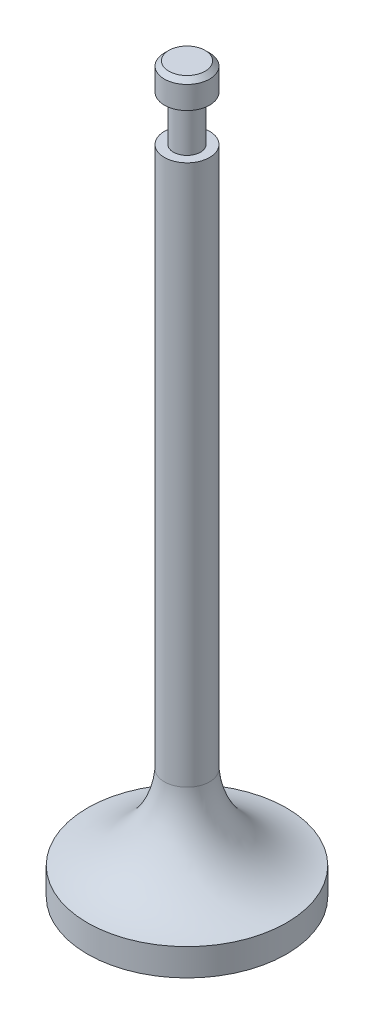
ISO-10303-21;
HEADER;
FILE_DESCRIPTION(('STEP AP214'),'2;1');
FILE_NAME('part.step','',(''),(''),'','','');
FILE_SCHEMA(('AUTOMOTIVE_DESIGN { 1 0 10303 214 1 1 1 1 }'));
ENDSEC;
DATA;
#1=APPLICATION_CONTEXT('core data for automotive mechanical design processes');
#2=APPLICATION_PROTOCOL_DEFINITION('international standard','automotive_design',2000,#1);
#3=PRODUCT_CONTEXT('',#1,'mechanical');
#4=PRODUCT('Part','Part','',(#3));
#5=PRODUCT_RELATED_PRODUCT_CATEGORY('part','',(#4));
#6=PRODUCT_DEFINITION_FORMATION('','',#4);
#7=PRODUCT_DEFINITION_CONTEXT('part definition',#1,'design');
#8=PRODUCT_DEFINITION('design','',#6,#7);
#9=PRODUCT_DEFINITION_SHAPE('','',#8);
#10=(LENGTH_UNIT() NAMED_UNIT(*) SI_UNIT(.MILLI.,.METRE.));
#11=(NAMED_UNIT(*) PLANE_ANGLE_UNIT() SI_UNIT($,.RADIAN.));
#12=(NAMED_UNIT(*) SI_UNIT($,.STERADIAN.) SOLID_ANGLE_UNIT());
#13=UNCERTAINTY_MEASURE_WITH_UNIT(LENGTH_MEASURE(1.E-05),#10,'distance_accuracy_value','');
#14=(GEOMETRIC_REPRESENTATION_CONTEXT(3) GLOBAL_UNCERTAINTY_ASSIGNED_CONTEXT((#13)) GLOBAL_UNIT_ASSIGNED_CONTEXT((#10,
#11,#12)) REPRESENTATION_CONTEXT('',''));
#15=CARTESIAN_POINT('',(0.,0.,0.));
#16=DIRECTION('',(0.,0.,1.));
#17=DIRECTION('',(1.,0.,0.));
#18=AXIS2_PLACEMENT_3D('',#15,#16,#17);
#19=CARTESIAN_POINT('',(2.49999999999998,80.,0.));
#20=DIRECTION('',(0.,-1.,0.));
#21=DIRECTION('',(1.,0.,0.));
#22=AXIS2_PLACEMENT_3D('',#19,#20,#21);
#23=PLANE('',#22);
#24=CARTESIAN_POINT('',(0.,80.,0.));
#25=DIRECTION('',(0.,-1.,0.));
#26=DIRECTION('',(1.,0.,0.));
#27=AXIS2_PLACEMENT_3D('',#24,#25,#26);
#28=CIRCLE('',#27,2.00000000000001);
#29=CARTESIAN_POINT('',(1.99999999999999,80.,0.));
#30=VERTEX_POINT('',#29);
#31=EDGE_CURVE('E45',#30,#30,#28,.F.);
#32=ORIENTED_EDGE('',*,*,#31,.T.);
#33=EDGE_LOOP('',(#32));
#34=FACE_BOUND('',#33,.T.);
#35=ADVANCED_FACE('F37',(#34),#23,.F.);
#36=CARTESIAN_POINT('',(0.,80.,0.));
#37=DIRECTION('',(0.,1.,0.));
#38=DIRECTION('',(-1.,0.,0.));
#39=AXIS2_PLACEMENT_3D('',#36,#37,#38);
#40=CYLINDRICAL_SURFACE('',#39,2.5);
#41=CARTESIAN_POINT('',(0.,79.5,0.));
#42=DIRECTION('',(0.,-1.,0.));
#43=DIRECTION('',(1.,0.,0.));
#44=AXIS2_PLACEMENT_3D('',#41,#42,#43);
#45=CIRCLE('',#44,2.5);
#46=CARTESIAN_POINT('',(2.49999999999998,79.5,0.));
#47=VERTEX_POINT('',#46);
#48=EDGE_CURVE('E10',#47,#47,#45,.T.);
#49=ORIENTED_EDGE('',*,*,#48,.T.);
#50=EDGE_LOOP('',(#49));
#51=FACE_BOUND('',#50,.T.);
#52=CARTESIAN_POINT('',(0.,77.,0.));
#53=DIRECTION('',(0.,1.,0.));
#54=DIRECTION('',(-1.,0.,0.));
#55=AXIS2_PLACEMENT_3D('',#52,#53,#54);
#56=CIRCLE('',#55,2.5);
#57=CARTESIAN_POINT('',(-2.50000000000002,77.,0.));
#58=VERTEX_POINT('',#57);
#59=EDGE_CURVE('E50',#58,#58,#56,.T.);
#60=ORIENTED_EDGE('',*,*,#59,.T.);
#61=EDGE_LOOP('',(#60));
#62=FACE_BOUND('',#61,.T.);
#63=ADVANCED_FACE('F96',(#51,#62),#40,.T.);
#64=CARTESIAN_POINT('',(1.49999999999998,77.,0.));
#65=DIRECTION('',(0.,1.,0.));
#66=DIRECTION('',(-1.,0.,0.));
#67=AXIS2_PLACEMENT_3D('',#64,#65,#66);
#68=PLANE('',#67);
#69=ORIENTED_EDGE('',*,*,#59,.F.);
#70=EDGE_LOOP('',(#69));
#71=FACE_BOUND('',#70,.T.);
#72=CARTESIAN_POINT('',(0.,77.,0.));
#73=DIRECTION('',(0.,1.,0.));
#74=DIRECTION('',(-1.,0.,0.));
#75=AXIS2_PLACEMENT_3D('',#72,#73,#74);
#76=CIRCLE('',#75,1.5);
#77=CARTESIAN_POINT('',(-1.50000000000002,77.,0.));
#78=VERTEX_POINT('',#77);
#79=EDGE_CURVE('E55',#78,#78,#76,.T.);
#80=ORIENTED_EDGE('',*,*,#79,.T.);
#81=EDGE_LOOP('',(#80));
#82=FACE_BOUND('',#81,.T.);
#83=ADVANCED_FACE('F100',(#71,#82),#68,.F.);
#84=CARTESIAN_POINT('',(0.,80.,0.));
#85=DIRECTION('',(0.,1.,0.));
#86=DIRECTION('',(-1.,0.,0.));
#87=AXIS2_PLACEMENT_3D('',#84,#85,#86);
#88=CYLINDRICAL_SURFACE('',#87,1.5);
#89=ORIENTED_EDGE('',*,*,#79,.F.);
#90=EDGE_LOOP('',(#89));
#91=FACE_BOUND('',#90,.T.);
#92=CARTESIAN_POINT('',(0.,72.,0.));
#93=DIRECTION('',(0.,1.,0.));
#94=DIRECTION('',(-1.,0.,0.));
#95=AXIS2_PLACEMENT_3D('',#92,#93,#94);
#96=CIRCLE('',#95,1.5);
#97=CARTESIAN_POINT('',(-1.50000000000002,72.,0.));
#98=VERTEX_POINT('',#97);
#99=EDGE_CURVE('E61',#98,#98,#96,.T.);
#100=ORIENTED_EDGE('',*,*,#99,.T.);
#101=EDGE_LOOP('',(#100));
#102=FACE_BOUND('',#101,.T.);
#103=ADVANCED_FACE('F105',(#91,#102),#88,.T.);
#104=CARTESIAN_POINT('',(2.5,72.,0.));
#105=DIRECTION('',(0.,-1.,0.));
#106=DIRECTION('',(1.,0.,0.));
#107=AXIS2_PLACEMENT_3D('',#104,#105,#106);
#108=PLANE('',#107);
#109=ORIENTED_EDGE('',*,*,#99,.F.);
#110=EDGE_LOOP('',(#109));
#111=FACE_BOUND('',#110,.T.);
#112=CARTESIAN_POINT('',(0.,72.,0.));
#113=DIRECTION('',(0.,1.,0.));
#114=DIRECTION('',(-1.,0.,0.));
#115=AXIS2_PLACEMENT_3D('',#112,#113,#114);
#116=CIRCLE('',#115,2.50000000000002);
#117=CARTESIAN_POINT('',(-2.50000000000003,72.,0.));
#118=VERTEX_POINT('',#117);
#119=EDGE_CURVE('E65',#118,#118,#116,.T.);
#120=ORIENTED_EDGE('',*,*,#119,.T.);
#121=EDGE_LOOP('',(#120));
#122=FACE_BOUND('',#121,.T.);
#123=ADVANCED_FACE('F109',(#111,#122),#108,.F.);
#124=CARTESIAN_POINT('',(0.,80.,0.));
#125=DIRECTION('',(0.,1.,0.));
#126=DIRECTION('',(-1.,0.,0.));
#127=AXIS2_PLACEMENT_3D('',#124,#125,#126);
#128=CYLINDRICAL_SURFACE('',#127,2.50000000000001);
#129=ORIENTED_EDGE('',*,*,#119,.F.);
#130=EDGE_LOOP('',(#129));
#131=FACE_BOUND('',#130,.T.);
#132=CARTESIAN_POINT('',(0.,12.2446611685843,0.));
#133=DIRECTION('',(0.,1.,0.));
#134=DIRECTION('',(-1.,0.,0.));
#135=AXIS2_PLACEMENT_3D('',#132,#133,#134);
#136=CIRCLE('',#135,2.5);
#137=CARTESIAN_POINT('',(-2.5,12.2446611685843,0.));
#138=VERTEX_POINT('',#137);
#139=EDGE_CURVE('E69',#138,#138,#136,.T.);
#140=ORIENTED_EDGE('',*,*,#139,.T.);
#141=EDGE_LOOP('',(#140));
#142=FACE_BOUND('',#141,.T.);
#143=ADVANCED_FACE('F113',(#131,#142),#128,.T.);
#144=CARTESIAN_POINT('',(0.,12.89,0.));
#145=DIRECTION('',(0.,1.,0.));
#146=DIRECTION('',(-1.,0.,0.));
#147=AXIS2_PLACEMENT_3D('',#144,#145,#146);
#148=TOROIDAL_SURFACE('',#147,12.4791551642745,10.);
#149=ORIENTED_EDGE('',*,*,#139,.F.);
#150=EDGE_LOOP('',(#149));
#151=FACE_BOUND('',#150,.T.);
#152=CARTESIAN_POINT('',(0.,3.,0.));
#153=DIRECTION('',(0.,1.,0.));
#154=DIRECTION('',(-1.,0.,0.));
#155=AXIS2_PLACEMENT_3D('',#152,#153,#154);
#156=CIRCLE('',#155,11.);
#157=CARTESIAN_POINT('',(-11.,3.,0.));
#158=VERTEX_POINT('',#157);
#159=EDGE_CURVE('E73',#158,#158,#156,.T.);
#160=ORIENTED_EDGE('',*,*,#159,.T.);
#161=EDGE_LOOP('',(#160));
#162=FACE_BOUND('',#161,.T.);
#163=ADVANCED_FACE('F92',(#151,#162),#148,.F.);
#164=CARTESIAN_POINT('',(0.,80.,0.));
#165=DIRECTION('',(0.,1.,0.));
#166=DIRECTION('',(-1.,0.,0.));
#167=AXIS2_PLACEMENT_3D('',#164,#165,#166);
#168=CYLINDRICAL_SURFACE('',#167,11.);
#169=ORIENTED_EDGE('',*,*,#159,.F.);
#170=EDGE_LOOP('',(#169));
#171=FACE_BOUND('',#170,.T.);
#172=CARTESIAN_POINT('',(0.,0.,0.));
#173=DIRECTION('',(0.,1.,0.));
#174=DIRECTION('',(-1.,0.,0.));
#175=AXIS2_PLACEMENT_3D('',#172,#173,#174);
#176=CIRCLE('',#175,11.);
#177=CARTESIAN_POINT('',(-11.,0.,0.));
#178=VERTEX_POINT('',#177);
#179=EDGE_CURVE('E77',#178,#178,#176,.T.);
#180=ORIENTED_EDGE('',*,*,#179,.T.);
#181=EDGE_LOOP('',(#180));
#182=FACE_BOUND('',#181,.T.);
#183=ADVANCED_FACE('F82',(#171,#182),#168,.T.);
#184=CARTESIAN_POINT('',(0.,0.,0.));
#185=DIRECTION('',(0.,1.,0.));
#186=DIRECTION('',(-1.,0.,0.));
#187=AXIS2_PLACEMENT_3D('',#184,#185,#186);
#188=PLANE('',#187);
#189=ORIENTED_EDGE('',*,*,#179,.F.);
#190=EDGE_LOOP('',(#189));
#191=FACE_BOUND('',#190,.T.);
#192=ADVANCED_FACE('F84',(#191),#188,.F.);
#193=CARTESIAN_POINT('',(0.,80.,0.));
#194=DIRECTION('',(0.,-1.,0.));
#195=DIRECTION('',(1.,0.,0.));
#196=AXIS2_PLACEMENT_3D('',#193,#194,#195);
#197=CONICAL_SURFACE('',#196,2.00000000000001,0.785398163397453);
#198=ORIENTED_EDGE('',*,*,#48,.F.);
#199=EDGE_LOOP('',(#198));
#200=FACE_BOUND('',#199,.T.);
#201=ORIENTED_EDGE('',*,*,#31,.F.);
#202=EDGE_LOOP('',(#201));
#203=FACE_BOUND('',#202,.T.);
#204=ADVANCED_FACE('F39',(#200,#203),#197,.T.);
#205=CLOSED_SHELL('',(#35,#63,#83,#103,#123,#143,#163,#183,#192,#204));
#206=MANIFOLD_SOLID_BREP('B2',#205);
#207=ADVANCED_BREP_SHAPE_REPRESENTATION('',(#18,#206),#14);
#208=SHAPE_DEFINITION_REPRESENTATION(#9,#207);
ENDSEC;
END-ISO-10303-21;
